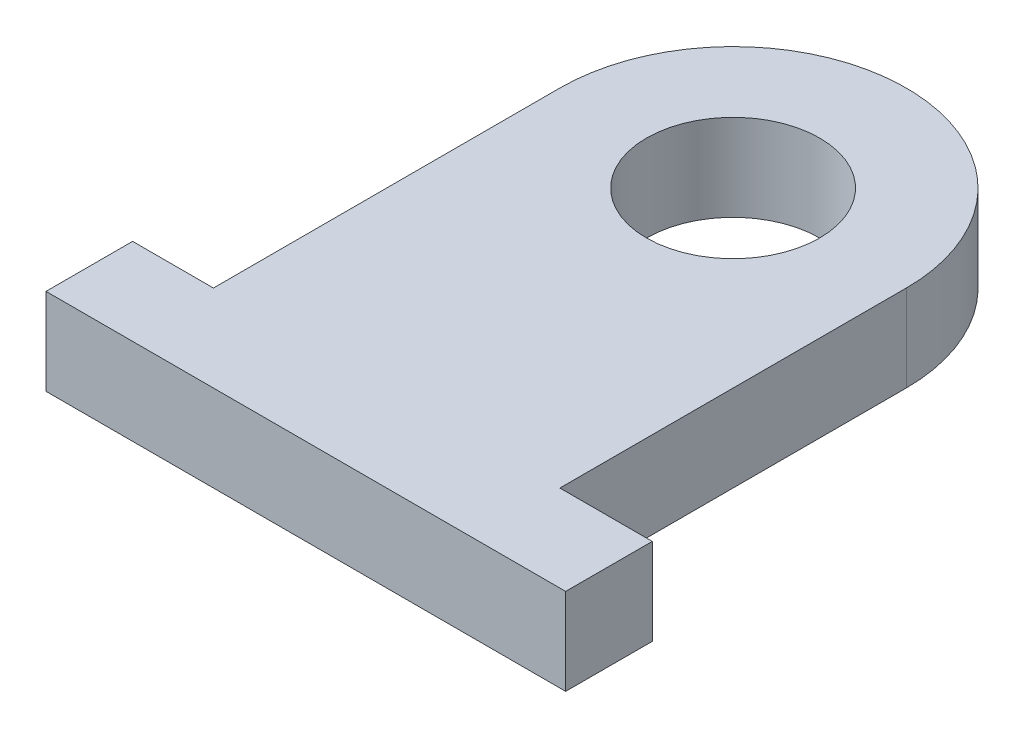
ISO-10303-21;
HEADER;
FILE_DESCRIPTION(('STEP AP214'),'2;1');
FILE_NAME('part.step','',(''),(''),'','','');
FILE_SCHEMA(('AUTOMOTIVE_DESIGN { 1 0 10303 214 1 1 1 1 }'));
ENDSEC;
DATA;
#1=APPLICATION_CONTEXT('core data for automotive mechanical design processes');
#2=APPLICATION_PROTOCOL_DEFINITION('international standard','automotive_design',2000,#1);
#3=PRODUCT_CONTEXT('',#1,'mechanical');
#4=PRODUCT('Part','Part','',(#3));
#5=PRODUCT_RELATED_PRODUCT_CATEGORY('part','',(#4));
#6=PRODUCT_DEFINITION_FORMATION('','',#4);
#7=PRODUCT_DEFINITION_CONTEXT('part definition',#1,'design');
#8=PRODUCT_DEFINITION('design','',#6,#7);
#9=PRODUCT_DEFINITION_SHAPE('','',#8);
#10=(LENGTH_UNIT() NAMED_UNIT(*) SI_UNIT(.MILLI.,.METRE.));
#11=(NAMED_UNIT(*) PLANE_ANGLE_UNIT() SI_UNIT($,.RADIAN.));
#12=(NAMED_UNIT(*) SI_UNIT($,.STERADIAN.) SOLID_ANGLE_UNIT());
#13=UNCERTAINTY_MEASURE_WITH_UNIT(LENGTH_MEASURE(1.E-05),#10,'distance_accuracy_value','');
#14=(GEOMETRIC_REPRESENTATION_CONTEXT(3) GLOBAL_UNCERTAINTY_ASSIGNED_CONTEXT((#13)) GLOBAL_UNIT_ASSIGNED_CONTEXT((#10,
#11,#12)) REPRESENTATION_CONTEXT('',''));
#15=CARTESIAN_POINT('',(0.,0.,0.));
#16=DIRECTION('',(0.,0.,1.));
#17=DIRECTION('',(1.,0.,0.));
#18=AXIS2_PLACEMENT_3D('',#15,#16,#17);
#19=CARTESIAN_POINT('',(0.,5.,0.));
#20=DIRECTION('',(0.,-1.,0.));
#21=DIRECTION('',(0.,0.,-1.));
#22=AXIS2_PLACEMENT_3D('',#19,#20,#21);
#23=PLANE('',#22);
#24=CARTESIAN_POINT('',(0.,5.,0.));
#25=DIRECTION('',(0.,1.,0.));
#26=DIRECTION('',(0.,0.,-1.));
#27=AXIS2_PLACEMENT_3D('',#24,#25,#26);
#28=CIRCLE('',#27,10.);
#29=CARTESIAN_POINT('',(10.,5.,0.));
#30=VERTEX_POINT('',#29);
#31=CARTESIAN_POINT('',(-10.,5.,0.));
#32=VERTEX_POINT('',#31);
#33=EDGE_CURVE('E140',#30,#32,#28,.T.);
#34=ORIENTED_EDGE('',*,*,#33,.T.);
#35=DIRECTION('',(0.,0.,1.));
#36=VECTOR('',#35,1.);
#37=CARTESIAN_POINT('',(-10.,5.,0.));
#38=LINE('',#37,#36);
#39=CARTESIAN_POINT('',(-10.,5.,20.));
#40=VERTEX_POINT('',#39);
#41=EDGE_CURVE('E74',#32,#40,#38,.T.);
#42=ORIENTED_EDGE('',*,*,#41,.T.);
#43=DIRECTION('',(-1.,0.,0.));
#44=VECTOR('',#43,1.);
#45=CARTESIAN_POINT('',(-14.6658418567442,5.,20.));
#46=LINE('',#45,#44);
#47=CARTESIAN_POINT('',(-14.6658418567442,5.,20.));
#48=VERTEX_POINT('',#47);
#49=EDGE_CURVE('E158',#40,#48,#46,.T.);
#50=ORIENTED_EDGE('',*,*,#49,.T.);
#51=DIRECTION('',(0.,0.,-1.));
#52=VECTOR('',#51,1.);
#53=CARTESIAN_POINT('',(-14.6658418567442,5.,25.));
#54=LINE('',#53,#52);
#55=CARTESIAN_POINT('',(-14.6658418567442,5.,25.));
#56=VERTEX_POINT('',#55);
#57=EDGE_CURVE('E110',#56,#48,#54,.T.);
#58=ORIENTED_EDGE('',*,*,#57,.F.);
#59=DIRECTION('',(-1.,0.,0.));
#60=VECTOR('',#59,1.);
#61=CARTESIAN_POINT('',(-14.6658418567442,5.,25.));
#62=LINE('',#61,#60);
#63=CARTESIAN_POINT('',(15.3341581432558,5.,25.));
#64=VERTEX_POINT('',#63);
#65=EDGE_CURVE('E103',#64,#56,#62,.T.);
#66=ORIENTED_EDGE('',*,*,#65,.F.);
#67=DIRECTION('',(0.,0.,-1.));
#68=VECTOR('',#67,1.);
#69=CARTESIAN_POINT('',(15.3341581432558,5.,25.));
#70=LINE('',#69,#68);
#71=CARTESIAN_POINT('',(15.3341581432558,5.,20.));
#72=VERTEX_POINT('',#71);
#73=EDGE_CURVE('E107',#64,#72,#70,.T.);
#74=ORIENTED_EDGE('',*,*,#73,.T.);
#75=CARTESIAN_POINT('',(10.,5.,20.));
#76=VERTEX_POINT('',#75);
#77=EDGE_CURVE('E175',#72,#76,#46,.T.);
#78=ORIENTED_EDGE('',*,*,#77,.T.);
#79=DIRECTION('',(0.,0.,-1.));
#80=VECTOR('',#79,1.);
#81=CARTESIAN_POINT('',(10.,5.,0.));
#82=LINE('',#81,#80);
#83=EDGE_CURVE('E50',#76,#30,#82,.T.);
#84=ORIENTED_EDGE('',*,*,#83,.T.);
#85=EDGE_LOOP('',(#34,#42,#50,#58,#66,#74,#78,#84));
#86=FACE_BOUND('',#85,.T.);
#87=CARTESIAN_POINT('',(0.,5.,0.));
#88=DIRECTION('',(0.,1.,0.));
#89=DIRECTION('',(0.,0.,1.));
#90=AXIS2_PLACEMENT_3D('',#87,#88,#89);
#91=CIRCLE('',#90,5.);
#92=CARTESIAN_POINT('',(0.,5.,5.));
#93=VERTEX_POINT('',#92);
#94=EDGE_CURVE('E131',#93,#93,#91,.T.);
#95=ORIENTED_EDGE('',*,*,#94,.F.);
#96=EDGE_LOOP('',(#95));
#97=FACE_BOUND('',#96,.T.);
#98=ADVANCED_FACE('F33',(#86,#97),#23,.F.);
#99=CARTESIAN_POINT('',(0.,0.,0.));
#100=DIRECTION('',(0.,-1.,0.));
#101=DIRECTION('',(0.,0.,-1.));
#102=AXIS2_PLACEMENT_3D('',#99,#100,#101);
#103=PLANE('',#102);
#104=CARTESIAN_POINT('',(0.,0.,0.));
#105=DIRECTION('',(0.,1.,0.));
#106=DIRECTION('',(0.,0.,-1.));
#107=AXIS2_PLACEMENT_3D('',#104,#105,#106);
#108=CIRCLE('',#107,10.);
#109=CARTESIAN_POINT('',(10.,0.,0.));
#110=VERTEX_POINT('',#109);
#111=CARTESIAN_POINT('',(-10.,0.,0.));
#112=VERTEX_POINT('',#111);
#113=EDGE_CURVE('E138',#110,#112,#108,.T.);
#114=ORIENTED_EDGE('',*,*,#113,.F.);
#115=DIRECTION('',(0.,0.,-1.));
#116=VECTOR('',#115,1.);
#117=CARTESIAN_POINT('',(10.,0.,0.));
#118=LINE('',#117,#116);
#119=CARTESIAN_POINT('',(10.,0.,20.));
#120=VERTEX_POINT('',#119);
#121=EDGE_CURVE('E67',#120,#110,#118,.T.);
#122=ORIENTED_EDGE('',*,*,#121,.F.);
#123=DIRECTION('',(1.,0.,0.));
#124=VECTOR('',#123,1.);
#125=CARTESIAN_POINT('',(-14.6658418567442,0.,20.));
#126=LINE('',#125,#124);
#127=CARTESIAN_POINT('',(15.3341581432558,0.,20.));
#128=VERTEX_POINT('',#127);
#129=EDGE_CURVE('E165',#120,#128,#126,.T.);
#130=ORIENTED_EDGE('',*,*,#129,.T.);
#131=DIRECTION('',(0.,0.,-1.));
#132=VECTOR('',#131,1.);
#133=CARTESIAN_POINT('',(15.3341581432558,0.,25.));
#134=LINE('',#133,#132);
#135=CARTESIAN_POINT('',(15.3341581432558,0.,25.));
#136=VERTEX_POINT('',#135);
#137=EDGE_CURVE('E171',#136,#128,#134,.T.);
#138=ORIENTED_EDGE('',*,*,#137,.F.);
#139=DIRECTION('',(1.,0.,0.));
#140=VECTOR('',#139,1.);
#141=CARTESIAN_POINT('',(-14.6658418567442,0.,25.));
#142=LINE('',#141,#140);
#143=CARTESIAN_POINT('',(-14.6658418567442,0.,25.));
#144=VERTEX_POINT('',#143);
#145=EDGE_CURVE('E119',#144,#136,#142,.T.);
#146=ORIENTED_EDGE('',*,*,#145,.F.);
#147=DIRECTION('',(0.,0.,-1.));
#148=VECTOR('',#147,1.);
#149=CARTESIAN_POINT('',(-14.6658418567442,0.,25.));
#150=LINE('',#149,#148);
#151=CARTESIAN_POINT('',(-14.6658418567442,0.,20.));
#152=VERTEX_POINT('',#151);
#153=EDGE_CURVE('E133',#144,#152,#150,.T.);
#154=ORIENTED_EDGE('',*,*,#153,.T.);
#155=CARTESIAN_POINT('',(-10.,0.,20.));
#156=VERTEX_POINT('',#155);
#157=EDGE_CURVE('E123',#152,#156,#126,.T.);
#158=ORIENTED_EDGE('',*,*,#157,.T.);
#159=DIRECTION('',(0.,0.,1.));
#160=VECTOR('',#159,1.);
#161=CARTESIAN_POINT('',(-10.,0.,0.));
#162=LINE('',#161,#160);
#163=EDGE_CURVE('E147',#112,#156,#162,.T.);
#164=ORIENTED_EDGE('',*,*,#163,.F.);
#165=EDGE_LOOP('',(#114,#122,#130,#138,#146,#154,#158,#164));
#166=FACE_BOUND('',#165,.T.);
#167=CARTESIAN_POINT('',(0.,0.,0.));
#168=DIRECTION('',(0.,1.,0.));
#169=DIRECTION('',(0.,0.,1.));
#170=AXIS2_PLACEMENT_3D('',#167,#168,#169);
#171=CIRCLE('',#170,5.);
#172=CARTESIAN_POINT('',(0.,0.,5.));
#173=VERTEX_POINT('',#172);
#174=EDGE_CURVE('E128',#173,#173,#171,.T.);
#175=ORIENTED_EDGE('',*,*,#174,.T.);
#176=EDGE_LOOP('',(#175));
#177=FACE_BOUND('',#176,.T.);
#178=ADVANCED_FACE('F162',(#166,#177),#103,.T.);
#179=CARTESIAN_POINT('',(0.,5.,0.));
#180=DIRECTION('',(0.,-1.,0.));
#181=DIRECTION('',(0.,0.,-1.));
#182=AXIS2_PLACEMENT_3D('',#179,#180,#181);
#183=CYLINDRICAL_SURFACE('',#182,10.);
#184=ORIENTED_EDGE('',*,*,#113,.T.);
#185=DIRECTION('',(0.,-1.,0.));
#186=VECTOR('',#185,1.);
#187=CARTESIAN_POINT('',(-10.,5.,0.));
#188=LINE('',#187,#186);
#189=EDGE_CURVE('E11',#32,#112,#188,.T.);
#190=ORIENTED_EDGE('',*,*,#189,.F.);
#191=ORIENTED_EDGE('',*,*,#33,.F.);
#192=DIRECTION('',(0.,-1.,0.));
#193=VECTOR('',#192,1.);
#194=CARTESIAN_POINT('',(10.,5.,0.));
#195=LINE('',#194,#193);
#196=EDGE_CURVE('E144',#30,#110,#195,.T.);
#197=ORIENTED_EDGE('',*,*,#196,.T.);
#198=EDGE_LOOP('',(#184,#190,#191,#197));
#199=FACE_BOUND('',#198,.T.);
#200=ADVANCED_FACE('F35',(#199),#183,.T.);
#201=CARTESIAN_POINT('',(-10.,5.,0.));
#202=DIRECTION('',(1.,0.,0.));
#203=DIRECTION('',(0.,0.,-1.));
#204=AXIS2_PLACEMENT_3D('',#201,#202,#203);
#205=PLANE('',#204);
#206=ORIENTED_EDGE('',*,*,#163,.T.);
#207=DIRECTION('',(0.,-1.,0.));
#208=VECTOR('',#207,1.);
#209=CARTESIAN_POINT('',(-10.,5.,20.));
#210=LINE('',#209,#208);
#211=EDGE_CURVE('E42',#40,#156,#210,.T.);
#212=ORIENTED_EDGE('',*,*,#211,.F.);
#213=ORIENTED_EDGE('',*,*,#41,.F.);
#214=ORIENTED_EDGE('',*,*,#189,.T.);
#215=EDGE_LOOP('',(#206,#212,#213,#214));
#216=FACE_BOUND('',#215,.T.);
#217=ADVANCED_FACE('F201',(#216),#205,.F.);
#218=CARTESIAN_POINT('',(10.,5.,0.));
#219=DIRECTION('',(-1.,0.,0.));
#220=DIRECTION('',(0.,0.,1.));
#221=AXIS2_PLACEMENT_3D('',#218,#219,#220);
#222=PLANE('',#221);
#223=ORIENTED_EDGE('',*,*,#121,.T.);
#224=ORIENTED_EDGE('',*,*,#196,.F.);
#225=ORIENTED_EDGE('',*,*,#83,.F.);
#226=DIRECTION('',(0.,-1.,0.));
#227=VECTOR('',#226,1.);
#228=CARTESIAN_POINT('',(10.,5.,20.));
#229=LINE('',#228,#227);
#230=EDGE_CURVE('E64',#76,#120,#229,.T.);
#231=ORIENTED_EDGE('',*,*,#230,.T.);
#232=EDGE_LOOP('',(#223,#224,#225,#231));
#233=FACE_BOUND('',#232,.T.);
#234=ADVANCED_FACE('F199',(#233),#222,.F.);
#235=CARTESIAN_POINT('',(0.,5.,0.));
#236=DIRECTION('',(0.,-1.,0.));
#237=DIRECTION('',(0.,0.,-1.));
#238=AXIS2_PLACEMENT_3D('',#235,#236,#237);
#239=CYLINDRICAL_SURFACE('',#238,5.);
#240=ORIENTED_EDGE('',*,*,#94,.T.);
#241=EDGE_LOOP('',(#240));
#242=FACE_BOUND('',#241,.T.);
#243=ORIENTED_EDGE('',*,*,#174,.F.);
#244=EDGE_LOOP('',(#243));
#245=FACE_BOUND('',#244,.T.);
#246=ADVANCED_FACE('F189',(#242,#245),#239,.F.);
#247=CARTESIAN_POINT('',(0.,0.,20.));
#248=DIRECTION('',(0.,0.,1.));
#249=DIRECTION('',(1.,0.,0.));
#250=AXIS2_PLACEMENT_3D('',#247,#248,#249);
#251=PLANE('',#250);
#252=ORIENTED_EDGE('',*,*,#49,.F.);
#253=ORIENTED_EDGE('',*,*,#211,.T.);
#254=ORIENTED_EDGE('',*,*,#157,.F.);
#255=DIRECTION('',(0.,-1.,0.));
#256=VECTOR('',#255,1.);
#257=CARTESIAN_POINT('',(-14.6658418567442,5.,20.));
#258=LINE('',#257,#256);
#259=EDGE_CURVE('E167',#48,#152,#258,.T.);
#260=ORIENTED_EDGE('',*,*,#259,.F.);
#261=EDGE_LOOP('',(#252,#253,#254,#260));
#262=FACE_BOUND('',#261,.T.);
#263=ADVANCED_FACE('F156',(#262),#251,.F.);
#264=CARTESIAN_POINT('',(15.3341581432558,5.,25.));
#265=DIRECTION('',(-1.,0.,0.));
#266=DIRECTION('',(0.,0.,1.));
#267=AXIS2_PLACEMENT_3D('',#264,#265,#266);
#268=PLANE('',#267);
#269=DIRECTION('',(0.,1.,0.));
#270=VECTOR('',#269,1.);
#271=CARTESIAN_POINT('',(15.3341581432558,5.,20.));
#272=LINE('',#271,#270);
#273=EDGE_CURVE('E127',#128,#72,#272,.T.);
#274=ORIENTED_EDGE('',*,*,#273,.T.);
#275=ORIENTED_EDGE('',*,*,#73,.F.);
#276=DIRECTION('',(0.,1.,0.));
#277=VECTOR('',#276,1.);
#278=CARTESIAN_POINT('',(15.3341581432558,5.,25.));
#279=LINE('',#278,#277);
#280=EDGE_CURVE('E114',#136,#64,#279,.T.);
#281=ORIENTED_EDGE('',*,*,#280,.F.);
#282=ORIENTED_EDGE('',*,*,#137,.T.);
#283=EDGE_LOOP('',(#274,#275,#281,#282));
#284=FACE_BOUND('',#283,.T.);
#285=ADVANCED_FACE('F125',(#284),#268,.F.);
#286=CARTESIAN_POINT('',(-14.6658418567442,5.,25.));
#287=DIRECTION('',(1.,0.,0.));
#288=DIRECTION('',(0.,0.,-1.));
#289=AXIS2_PLACEMENT_3D('',#286,#287,#288);
#290=PLANE('',#289);
#291=ORIENTED_EDGE('',*,*,#259,.T.);
#292=ORIENTED_EDGE('',*,*,#153,.F.);
#293=DIRECTION('',(0.,-1.,0.));
#294=VECTOR('',#293,1.);
#295=CARTESIAN_POINT('',(-14.6658418567442,5.,25.));
#296=LINE('',#295,#294);
#297=EDGE_CURVE('E113',#56,#144,#296,.T.);
#298=ORIENTED_EDGE('',*,*,#297,.F.);
#299=ORIENTED_EDGE('',*,*,#57,.T.);
#300=EDGE_LOOP('',(#291,#292,#298,#299));
#301=FACE_BOUND('',#300,.T.);
#302=ADVANCED_FACE('F177',(#301),#290,.F.);
#303=CARTESIAN_POINT('',(0.,0.,25.));
#304=DIRECTION('',(0.,0.,1.));
#305=DIRECTION('',(1.,0.,0.));
#306=AXIS2_PLACEMENT_3D('',#303,#304,#305);
#307=PLANE('',#306);
#308=ORIENTED_EDGE('',*,*,#280,.T.);
#309=ORIENTED_EDGE('',*,*,#65,.T.);
#310=ORIENTED_EDGE('',*,*,#297,.T.);
#311=ORIENTED_EDGE('',*,*,#145,.T.);
#312=EDGE_LOOP('',(#308,#309,#310,#311));
#313=FACE_BOUND('',#312,.T.);
#314=ADVANCED_FACE('F117',(#313),#307,.T.);
#315=ORIENTED_EDGE('',*,*,#230,.F.);
#316=ORIENTED_EDGE('',*,*,#77,.F.);
#317=ORIENTED_EDGE('',*,*,#273,.F.);
#318=ORIENTED_EDGE('',*,*,#129,.F.);
#319=EDGE_LOOP('',(#315,#316,#317,#318));
#320=FACE_BOUND('',#319,.T.);
#321=ADVANCED_FACE('F180',(#320),#251,.F.);
#322=CLOSED_SHELL('',(#98,#178,#200,#217,#234,#246,#263,#285,#302,#314,#321));
#323=MANIFOLD_SOLID_BREP('B2',#322);
#324=ADVANCED_BREP_SHAPE_REPRESENTATION('',(#18,#323),#14);
#325=SHAPE_DEFINITION_REPRESENTATION(#9,#324);
ENDSEC;
END-ISO-10303-21;
